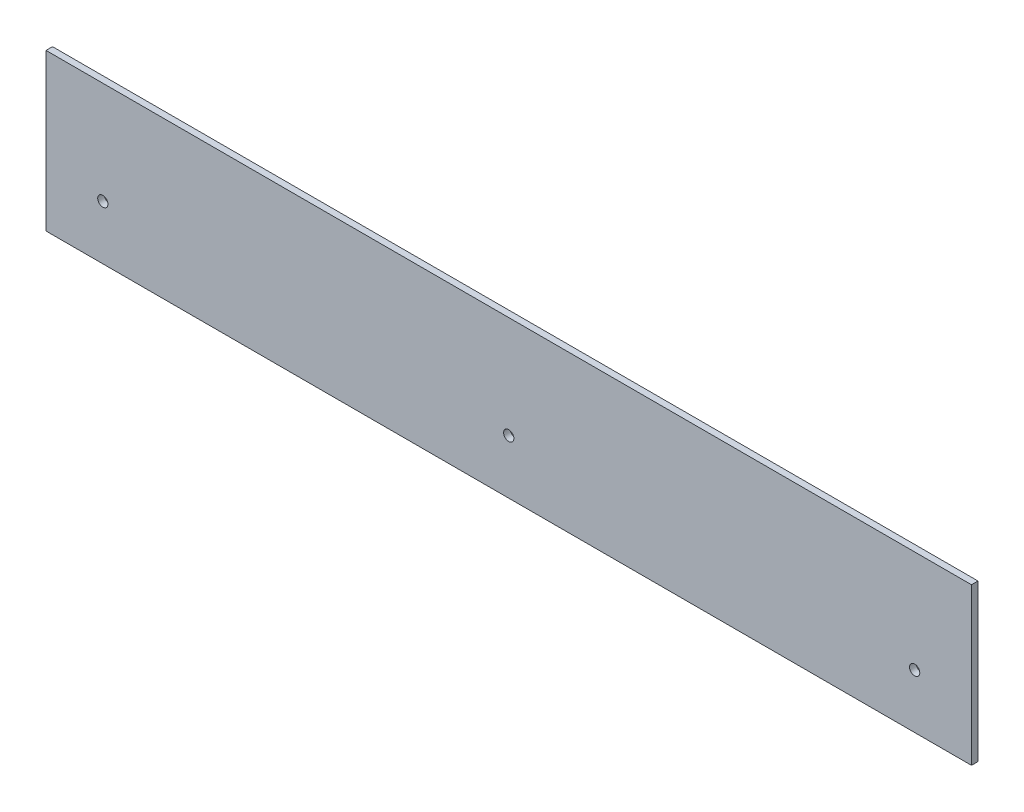
ISO-10303-21;
HEADER;
FILE_DESCRIPTION(('STEP AP214'),'2;1');
FILE_NAME('part.step','',(''),(''),'','','');
FILE_SCHEMA(('AUTOMOTIVE_DESIGN { 1 0 10303 214 1 1 1 1 }'));
ENDSEC;
DATA;
#1=APPLICATION_CONTEXT('core data for automotive mechanical design processes');
#2=APPLICATION_PROTOCOL_DEFINITION('international standard','automotive_design',2000,#1);
#3=PRODUCT_CONTEXT('',#1,'mechanical');
#4=PRODUCT('Part','Part','',(#3));
#5=PRODUCT_RELATED_PRODUCT_CATEGORY('part','',(#4));
#6=PRODUCT_DEFINITION_FORMATION('','',#4);
#7=PRODUCT_DEFINITION_CONTEXT('part definition',#1,'design');
#8=PRODUCT_DEFINITION('design','',#6,#7);
#9=PRODUCT_DEFINITION_SHAPE('','',#8);
#10=(LENGTH_UNIT() NAMED_UNIT(*) SI_UNIT(.MILLI.,.METRE.));
#11=(NAMED_UNIT(*) PLANE_ANGLE_UNIT() SI_UNIT($,.RADIAN.));
#12=(NAMED_UNIT(*) SI_UNIT($,.STERADIAN.) SOLID_ANGLE_UNIT());
#13=UNCERTAINTY_MEASURE_WITH_UNIT(LENGTH_MEASURE(1.E-05),#10,'distance_accuracy_value','');
#14=(GEOMETRIC_REPRESENTATION_CONTEXT(3) GLOBAL_UNCERTAINTY_ASSIGNED_CONTEXT((#13)) GLOBAL_UNIT_ASSIGNED_CONTEXT((#10,
#11,#12)) REPRESENTATION_CONTEXT('',''));
#15=CARTESIAN_POINT('',(0.,0.,0.));
#16=DIRECTION('',(0.,0.,1.));
#17=DIRECTION('',(1.,0.,0.));
#18=AXIS2_PLACEMENT_3D('',#15,#16,#17);
#19=CARTESIAN_POINT('',(0.,0.,3.175));
#20=DIRECTION('',(0.,0.,1.));
#21=DIRECTION('',(1.,0.,0.));
#22=AXIS2_PLACEMENT_3D('',#19,#20,#21);
#23=PLANE('',#22);
#24=CARTESIAN_POINT('',(-197.739,-11.684,3.175));
#25=DIRECTION('',(0.,0.,1.));
#26=DIRECTION('',(1.,0.,0.));
#27=AXIS2_PLACEMENT_3D('',#24,#25,#26);
#28=CIRCLE('',#27,2.5);
#29=CARTESIAN_POINT('',(-195.239,-11.684,3.175));
#30=VERTEX_POINT('',#29);
#31=EDGE_CURVE('E154',#30,#30,#28,.T.);
#32=ORIENTED_EDGE('',*,*,#31,.F.);
#33=EDGE_LOOP('',(#32));
#34=FACE_BOUND('',#33,.T.);
#35=DIRECTION('',(0.,1.,0.));
#36=VECTOR('',#35,1.);
#37=CARTESIAN_POINT('',(225.425,38.1,3.175));
#38=LINE('',#37,#36);
#39=CARTESIAN_POINT('',(225.425,-38.1,3.175));
#40=VERTEX_POINT('',#39);
#41=CARTESIAN_POINT('',(225.425,38.1,3.175));
#42=VERTEX_POINT('',#41);
#43=EDGE_CURVE('E97',#40,#42,#38,.T.);
#44=ORIENTED_EDGE('',*,*,#43,.T.);
#45=DIRECTION('',(-1.,0.,0.));
#46=VECTOR('',#45,1.);
#47=CARTESIAN_POINT('',(-225.425,38.1,3.175));
#48=LINE('',#47,#46);
#49=CARTESIAN_POINT('',(-225.425,38.1,3.175));
#50=VERTEX_POINT('',#49);
#51=EDGE_CURVE('E92',#42,#50,#48,.T.);
#52=ORIENTED_EDGE('',*,*,#51,.T.);
#53=DIRECTION('',(0.,-1.,0.));
#54=VECTOR('',#53,1.);
#55=CARTESIAN_POINT('',(-225.425,38.1,3.175));
#56=LINE('',#55,#54);
#57=CARTESIAN_POINT('',(-225.425,-38.1,3.175));
#58=VERTEX_POINT('',#57);
#59=EDGE_CURVE('E95',#50,#58,#56,.T.);
#60=ORIENTED_EDGE('',*,*,#59,.T.);
#61=DIRECTION('',(1.,0.,0.));
#62=VECTOR('',#61,1.);
#63=CARTESIAN_POINT('',(-225.425,-38.1,3.175));
#64=LINE('',#63,#62);
#65=EDGE_CURVE('E62',#58,#40,#64,.T.);
#66=ORIENTED_EDGE('',*,*,#65,.T.);
#67=EDGE_LOOP('',(#44,#52,#60,#66));
#68=FACE_BOUND('',#67,.T.);
#69=CARTESIAN_POINT('',(0.,-11.684,3.175));
#70=DIRECTION('',(0.,0.,1.));
#71=DIRECTION('',(1.,0.,0.));
#72=AXIS2_PLACEMENT_3D('',#69,#70,#71);
#73=CIRCLE('',#72,2.5);
#74=CARTESIAN_POINT('',(2.5,-11.684,3.175));
#75=VERTEX_POINT('',#74);
#76=EDGE_CURVE('E142',#75,#75,#73,.T.);
#77=ORIENTED_EDGE('',*,*,#76,.F.);
#78=EDGE_LOOP('',(#77));
#79=FACE_BOUND('',#78,.T.);
#80=CARTESIAN_POINT('',(197.739,-11.684,3.175));
#81=DIRECTION('',(0.,0.,-1.));
#82=DIRECTION('',(-1.,0.,0.));
#83=AXIS2_PLACEMENT_3D('',#80,#81,#82);
#84=CIRCLE('',#83,2.5);
#85=CARTESIAN_POINT('',(195.239,-11.684,3.175));
#86=VERTEX_POINT('',#85);
#87=EDGE_CURVE('E150',#86,#86,#84,.T.);
#88=ORIENTED_EDGE('',*,*,#87,.T.);
#89=EDGE_LOOP('',(#88));
#90=FACE_BOUND('',#89,.T.);
#91=ADVANCED_FACE('F44',(#34,#68,#79,#90),#23,.T.);
#92=CARTESIAN_POINT('',(0.,0.,0.));
#93=DIRECTION('',(0.,0.,1.));
#94=DIRECTION('',(1.,0.,0.));
#95=AXIS2_PLACEMENT_3D('',#92,#93,#94);
#96=PLANE('',#95);
#97=CARTESIAN_POINT('',(-197.739,-11.684,0.));
#98=DIRECTION('',(0.,0.,1.));
#99=DIRECTION('',(1.,0.,0.));
#100=AXIS2_PLACEMENT_3D('',#97,#98,#99);
#101=CIRCLE('',#100,2.5);
#102=CARTESIAN_POINT('',(-195.239,-11.684,0.));
#103=VERTEX_POINT('',#102);
#104=EDGE_CURVE('E118',#103,#103,#101,.T.);
#105=ORIENTED_EDGE('',*,*,#104,.T.);
#106=EDGE_LOOP('',(#105));
#107=FACE_BOUND('',#106,.T.);
#108=CARTESIAN_POINT('',(0.,-11.684,0.));
#109=DIRECTION('',(0.,0.,1.));
#110=DIRECTION('',(1.,0.,0.));
#111=AXIS2_PLACEMENT_3D('',#108,#109,#110);
#112=CIRCLE('',#111,2.5);
#113=CARTESIAN_POINT('',(2.5,-11.684,0.));
#114=VERTEX_POINT('',#113);
#115=EDGE_CURVE('E138',#114,#114,#112,.T.);
#116=ORIENTED_EDGE('',*,*,#115,.T.);
#117=EDGE_LOOP('',(#116));
#118=FACE_BOUND('',#117,.T.);
#119=DIRECTION('',(0.,1.,0.));
#120=VECTOR('',#119,1.);
#121=CARTESIAN_POINT('',(225.425,38.1,0.));
#122=LINE('',#121,#120);
#123=CARTESIAN_POINT('',(225.425,-38.1,0.));
#124=VERTEX_POINT('',#123);
#125=CARTESIAN_POINT('',(225.425,38.1,0.));
#126=VERTEX_POINT('',#125);
#127=EDGE_CURVE('E114',#124,#126,#122,.T.);
#128=ORIENTED_EDGE('',*,*,#127,.F.);
#129=DIRECTION('',(1.,0.,0.));
#130=VECTOR('',#129,1.);
#131=CARTESIAN_POINT('',(-225.425,-38.1,0.));
#132=LINE('',#131,#130);
#133=CARTESIAN_POINT('',(-225.425,-38.1,0.));
#134=VERTEX_POINT('',#133);
#135=EDGE_CURVE('E85',#134,#124,#132,.T.);
#136=ORIENTED_EDGE('',*,*,#135,.F.);
#137=DIRECTION('',(0.,-1.,0.));
#138=VECTOR('',#137,1.);
#139=CARTESIAN_POINT('',(-225.425,38.1,0.));
#140=LINE('',#139,#138);
#141=CARTESIAN_POINT('',(-225.425,38.1,0.));
#142=VERTEX_POINT('',#141);
#143=EDGE_CURVE('E79',#142,#134,#140,.T.);
#144=ORIENTED_EDGE('',*,*,#143,.F.);
#145=DIRECTION('',(-1.,0.,0.));
#146=VECTOR('',#145,1.);
#147=CARTESIAN_POINT('',(-225.425,38.1,0.));
#148=LINE('',#147,#146);
#149=EDGE_CURVE('E102',#126,#142,#148,.T.);
#150=ORIENTED_EDGE('',*,*,#149,.F.);
#151=EDGE_LOOP('',(#128,#136,#144,#150));
#152=FACE_BOUND('',#151,.T.);
#153=CARTESIAN_POINT('',(197.739,-11.684,0.));
#154=DIRECTION('',(0.,0.,-1.));
#155=DIRECTION('',(-1.,0.,0.));
#156=AXIS2_PLACEMENT_3D('',#153,#154,#155);
#157=CIRCLE('',#156,2.5);
#158=CARTESIAN_POINT('',(195.239,-11.684,0.));
#159=VERTEX_POINT('',#158);
#160=EDGE_CURVE('E146',#159,#159,#157,.T.);
#161=ORIENTED_EDGE('',*,*,#160,.F.);
#162=EDGE_LOOP('',(#161));
#163=FACE_BOUND('',#162,.T.);
#164=ADVANCED_FACE('F132',(#107,#118,#152,#163),#96,.F.);
#165=CARTESIAN_POINT('',(225.425,38.1,3.175));
#166=DIRECTION('',(-1.,0.,0.));
#167=DIRECTION('',(0.,0.,1.));
#168=AXIS2_PLACEMENT_3D('',#165,#166,#167);
#169=PLANE('',#168);
#170=ORIENTED_EDGE('',*,*,#127,.T.);
#171=DIRECTION('',(0.,0.,-1.));
#172=VECTOR('',#171,1.);
#173=CARTESIAN_POINT('',(225.425,38.1,3.175));
#174=LINE('',#173,#172);
#175=EDGE_CURVE('E11',#42,#126,#174,.T.);
#176=ORIENTED_EDGE('',*,*,#175,.F.);
#177=ORIENTED_EDGE('',*,*,#43,.F.);
#178=DIRECTION('',(0.,0.,-1.));
#179=VECTOR('',#178,1.);
#180=CARTESIAN_POINT('',(225.425,-38.1,3.175));
#181=LINE('',#180,#179);
#182=EDGE_CURVE('E110',#40,#124,#181,.T.);
#183=ORIENTED_EDGE('',*,*,#182,.T.);
#184=EDGE_LOOP('',(#170,#176,#177,#183));
#185=FACE_BOUND('',#184,.T.);
#186=ADVANCED_FACE('F46',(#185),#169,.F.);
#187=CARTESIAN_POINT('',(-225.425,38.1,3.175));
#188=DIRECTION('',(0.,-1.,0.));
#189=DIRECTION('',(0.,0.,-1.));
#190=AXIS2_PLACEMENT_3D('',#187,#188,#189);
#191=PLANE('',#190);
#192=ORIENTED_EDGE('',*,*,#149,.T.);
#193=DIRECTION('',(0.,0.,-1.));
#194=VECTOR('',#193,1.);
#195=CARTESIAN_POINT('',(-225.425,38.1,3.175));
#196=LINE('',#195,#194);
#197=EDGE_CURVE('E54',#50,#142,#196,.T.);
#198=ORIENTED_EDGE('',*,*,#197,.F.);
#199=ORIENTED_EDGE('',*,*,#51,.F.);
#200=ORIENTED_EDGE('',*,*,#175,.T.);
#201=EDGE_LOOP('',(#192,#198,#199,#200));
#202=FACE_BOUND('',#201,.T.);
#203=ADVANCED_FACE('F101',(#202),#191,.F.);
#204=CARTESIAN_POINT('',(-225.425,38.1,3.175));
#205=DIRECTION('',(1.,0.,0.));
#206=DIRECTION('',(0.,0.,-1.));
#207=AXIS2_PLACEMENT_3D('',#204,#205,#206);
#208=PLANE('',#207);
#209=ORIENTED_EDGE('',*,*,#143,.T.);
#210=DIRECTION('',(0.,0.,-1.));
#211=VECTOR('',#210,1.);
#212=CARTESIAN_POINT('',(-225.425,-38.1,3.175));
#213=LINE('',#212,#211);
#214=EDGE_CURVE('E104',#58,#134,#213,.T.);
#215=ORIENTED_EDGE('',*,*,#214,.F.);
#216=ORIENTED_EDGE('',*,*,#59,.F.);
#217=ORIENTED_EDGE('',*,*,#197,.T.);
#218=EDGE_LOOP('',(#209,#215,#216,#217));
#219=FACE_BOUND('',#218,.T.);
#220=ADVANCED_FACE('F105',(#219),#208,.F.);
#221=CARTESIAN_POINT('',(-225.425,-38.1,3.175));
#222=DIRECTION('',(0.,1.,0.));
#223=DIRECTION('',(0.,0.,1.));
#224=AXIS2_PLACEMENT_3D('',#221,#222,#223);
#225=PLANE('',#224);
#226=ORIENTED_EDGE('',*,*,#135,.T.);
#227=ORIENTED_EDGE('',*,*,#182,.F.);
#228=ORIENTED_EDGE('',*,*,#65,.F.);
#229=ORIENTED_EDGE('',*,*,#214,.T.);
#230=EDGE_LOOP('',(#226,#227,#228,#229));
#231=FACE_BOUND('',#230,.T.);
#232=ADVANCED_FACE('F129',(#231),#225,.F.);
#233=CARTESIAN_POINT('',(0.,-11.684,0.));
#234=DIRECTION('',(0.,0.,1.));
#235=DIRECTION('',(1.,0.,0.));
#236=AXIS2_PLACEMENT_3D('',#233,#234,#235);
#237=CYLINDRICAL_SURFACE('',#236,2.5);
#238=ORIENTED_EDGE('',*,*,#115,.F.);
#239=EDGE_LOOP('',(#238));
#240=FACE_BOUND('',#239,.T.);
#241=ORIENTED_EDGE('',*,*,#76,.T.);
#242=EDGE_LOOP('',(#241));
#243=FACE_BOUND('',#242,.T.);
#244=ADVANCED_FACE('F180',(#240,#243),#237,.F.);
#245=CARTESIAN_POINT('',(197.739,-11.684,0.));
#246=DIRECTION('',(0.,0.,1.));
#247=DIRECTION('',(1.,0.,0.));
#248=AXIS2_PLACEMENT_3D('',#245,#246,#247);
#249=CYLINDRICAL_SURFACE('',#248,2.5);
#250=ORIENTED_EDGE('',*,*,#160,.T.);
#251=EDGE_LOOP('',(#250));
#252=FACE_BOUND('',#251,.T.);
#253=ORIENTED_EDGE('',*,*,#87,.F.);
#254=EDGE_LOOP('',(#253));
#255=FACE_BOUND('',#254,.T.);
#256=ADVANCED_FACE('F168',(#252,#255),#249,.F.);
#257=CARTESIAN_POINT('',(-197.739,-11.684,0.));
#258=DIRECTION('',(0.,0.,1.));
#259=DIRECTION('',(1.,0.,0.));
#260=AXIS2_PLACEMENT_3D('',#257,#258,#259);
#261=CYLINDRICAL_SURFACE('',#260,2.5);
#262=ORIENTED_EDGE('',*,*,#104,.F.);
#263=EDGE_LOOP('',(#262));
#264=FACE_BOUND('',#263,.T.);
#265=ORIENTED_EDGE('',*,*,#31,.T.);
#266=EDGE_LOOP('',(#265));
#267=FACE_BOUND('',#266,.T.);
#268=ADVANCED_FACE('F165',(#264,#267),#261,.F.);
#269=CLOSED_SHELL('',(#91,#164,#186,#203,#220,#232,#244,#256,#268));
#270=MANIFOLD_SOLID_BREP('B2',#269);
#271=ADVANCED_BREP_SHAPE_REPRESENTATION('',(#18,#270),#14);
#272=SHAPE_DEFINITION_REPRESENTATION(#9,#271);
ENDSEC;
END-ISO-10303-21;
